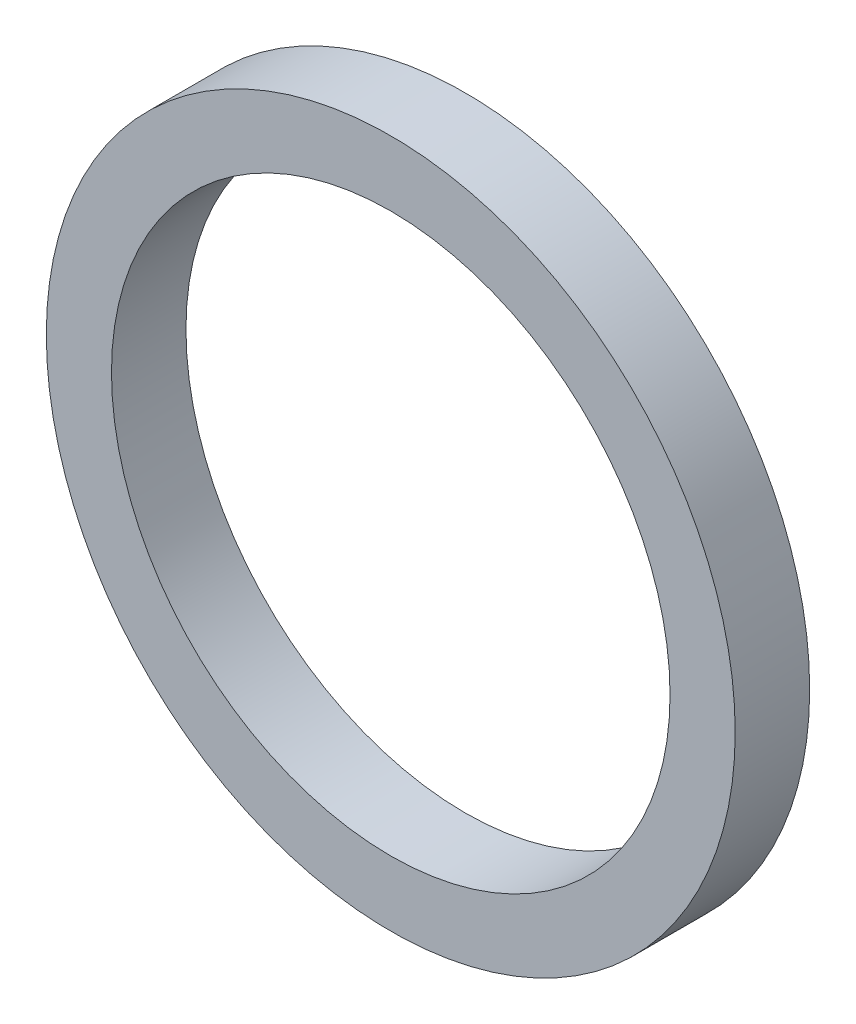
ISO-10303-21;
HEADER;
FILE_DESCRIPTION(('STEP AP214'),'2;1');
FILE_NAME('part.step','',(''),(''),'','','');
FILE_SCHEMA(('AUTOMOTIVE_DESIGN { 1 0 10303 214 1 1 1 1 }'));
ENDSEC;
DATA;
#1=APPLICATION_CONTEXT('core data for automotive mechanical design processes');
#2=APPLICATION_PROTOCOL_DEFINITION('international standard','automotive_design',2000,#1);
#3=PRODUCT_CONTEXT('',#1,'mechanical');
#4=PRODUCT('Part','Part','',(#3));
#5=PRODUCT_RELATED_PRODUCT_CATEGORY('part','',(#4));
#6=PRODUCT_DEFINITION_FORMATION('','',#4);
#7=PRODUCT_DEFINITION_CONTEXT('part definition',#1,'design');
#8=PRODUCT_DEFINITION('design','',#6,#7);
#9=PRODUCT_DEFINITION_SHAPE('','',#8);
#10=(LENGTH_UNIT() NAMED_UNIT(*) SI_UNIT(.MILLI.,.METRE.));
#11=(NAMED_UNIT(*) PLANE_ANGLE_UNIT() SI_UNIT($,.RADIAN.));
#12=(NAMED_UNIT(*) SI_UNIT($,.STERADIAN.) SOLID_ANGLE_UNIT());
#13=UNCERTAINTY_MEASURE_WITH_UNIT(LENGTH_MEASURE(1.E-05),#10,'distance_accuracy_value','');
#14=(GEOMETRIC_REPRESENTATION_CONTEXT(3) GLOBAL_UNCERTAINTY_ASSIGNED_CONTEXT((#13)) GLOBAL_UNIT_ASSIGNED_CONTEXT((#10,
#11,#12)) REPRESENTATION_CONTEXT('',''));
#15=CARTESIAN_POINT('',(0.,0.,0.));
#16=DIRECTION('',(0.,0.,1.));
#17=DIRECTION('',(1.,0.,0.));
#18=AXIS2_PLACEMENT_3D('',#15,#16,#17);
#19=CARTESIAN_POINT('',(0.,0.,4.));
#20=DIRECTION('',(0.,0.,1.));
#21=DIRECTION('',(1.,0.,0.));
#22=AXIS2_PLACEMENT_3D('',#19,#20,#21);
#23=PLANE('',#22);
#24=CARTESIAN_POINT('',(0.,0.,4.));
#25=DIRECTION('',(0.,0.,1.));
#26=DIRECTION('',(1.,0.,0.));
#27=AXIS2_PLACEMENT_3D('',#24,#25,#26);
#28=CIRCLE('',#27,18.5);
#29=CARTESIAN_POINT('',(18.5,0.,4.));
#30=VERTEX_POINT('',#29);
#31=EDGE_CURVE('E10',#30,#30,#28,.T.);
#32=ORIENTED_EDGE('',*,*,#31,.T.);
#33=EDGE_LOOP('',(#32));
#34=FACE_BOUND('',#33,.T.);
#35=CARTESIAN_POINT('',(0.,0.,4.));
#36=DIRECTION('',(0.,0.,1.));
#37=DIRECTION('',(1.,0.,0.));
#38=AXIS2_PLACEMENT_3D('',#35,#36,#37);
#39=CIRCLE('',#38,15.);
#40=CARTESIAN_POINT('',(15.,0.,4.));
#41=VERTEX_POINT('',#40);
#42=EDGE_CURVE('E44',#41,#41,#39,.T.);
#43=ORIENTED_EDGE('',*,*,#42,.F.);
#44=EDGE_LOOP('',(#43));
#45=FACE_BOUND('',#44,.T.);
#46=ADVANCED_FACE('F33',(#34,#45),#23,.T.);
#47=CARTESIAN_POINT('',(0.,0.,0.));
#48=DIRECTION('',(0.,0.,1.));
#49=DIRECTION('',(1.,0.,0.));
#50=AXIS2_PLACEMENT_3D('',#47,#48,#49);
#51=PLANE('',#50);
#52=CARTESIAN_POINT('',(0.,0.,0.));
#53=DIRECTION('',(0.,0.,1.));
#54=DIRECTION('',(1.,0.,0.));
#55=AXIS2_PLACEMENT_3D('',#52,#53,#54);
#56=CIRCLE('',#55,18.5);
#57=CARTESIAN_POINT('',(18.5,0.,0.));
#58=VERTEX_POINT('',#57);
#59=EDGE_CURVE('E37',#58,#58,#56,.T.);
#60=ORIENTED_EDGE('',*,*,#59,.F.);
#61=EDGE_LOOP('',(#60));
#62=FACE_BOUND('',#61,.T.);
#63=CARTESIAN_POINT('',(0.,0.,0.));
#64=DIRECTION('',(0.,0.,1.));
#65=DIRECTION('',(1.,0.,0.));
#66=AXIS2_PLACEMENT_3D('',#63,#64,#65);
#67=CIRCLE('',#66,15.);
#68=CARTESIAN_POINT('',(15.,0.,0.));
#69=VERTEX_POINT('',#68);
#70=EDGE_CURVE('E46',#69,#69,#67,.T.);
#71=ORIENTED_EDGE('',*,*,#70,.T.);
#72=EDGE_LOOP('',(#71));
#73=FACE_BOUND('',#72,.T.);
#74=ADVANCED_FACE('F56',(#62,#73),#51,.F.);
#75=CARTESIAN_POINT('',(0.,0.,4.));
#76=DIRECTION('',(0.,0.,-1.));
#77=DIRECTION('',(-1.,0.,0.));
#78=AXIS2_PLACEMENT_3D('',#75,#76,#77);
#79=CYLINDRICAL_SURFACE('',#78,18.5);
#80=ORIENTED_EDGE('',*,*,#31,.F.);
#81=EDGE_LOOP('',(#80));
#82=FACE_BOUND('',#81,.T.);
#83=ORIENTED_EDGE('',*,*,#59,.T.);
#84=EDGE_LOOP('',(#83));
#85=FACE_BOUND('',#84,.T.);
#86=ADVANCED_FACE('F35',(#82,#85),#79,.T.);
#87=CARTESIAN_POINT('',(0.,0.,4.));
#88=DIRECTION('',(0.,0.,-1.));
#89=DIRECTION('',(-1.,0.,0.));
#90=AXIS2_PLACEMENT_3D('',#87,#88,#89);
#91=CYLINDRICAL_SURFACE('',#90,15.);
#92=ORIENTED_EDGE('',*,*,#42,.T.);
#93=EDGE_LOOP('',(#92));
#94=FACE_BOUND('',#93,.T.);
#95=ORIENTED_EDGE('',*,*,#70,.F.);
#96=EDGE_LOOP('',(#95));
#97=FACE_BOUND('',#96,.T.);
#98=ADVANCED_FACE('F52',(#94,#97),#91,.F.);
#99=CLOSED_SHELL('',(#46,#74,#86,#98));
#100=MANIFOLD_SOLID_BREP('B2',#99);
#101=ADVANCED_BREP_SHAPE_REPRESENTATION('',(#18,#100),#14);
#102=SHAPE_DEFINITION_REPRESENTATION(#9,#101);
ENDSEC;
END-ISO-10303-21;
